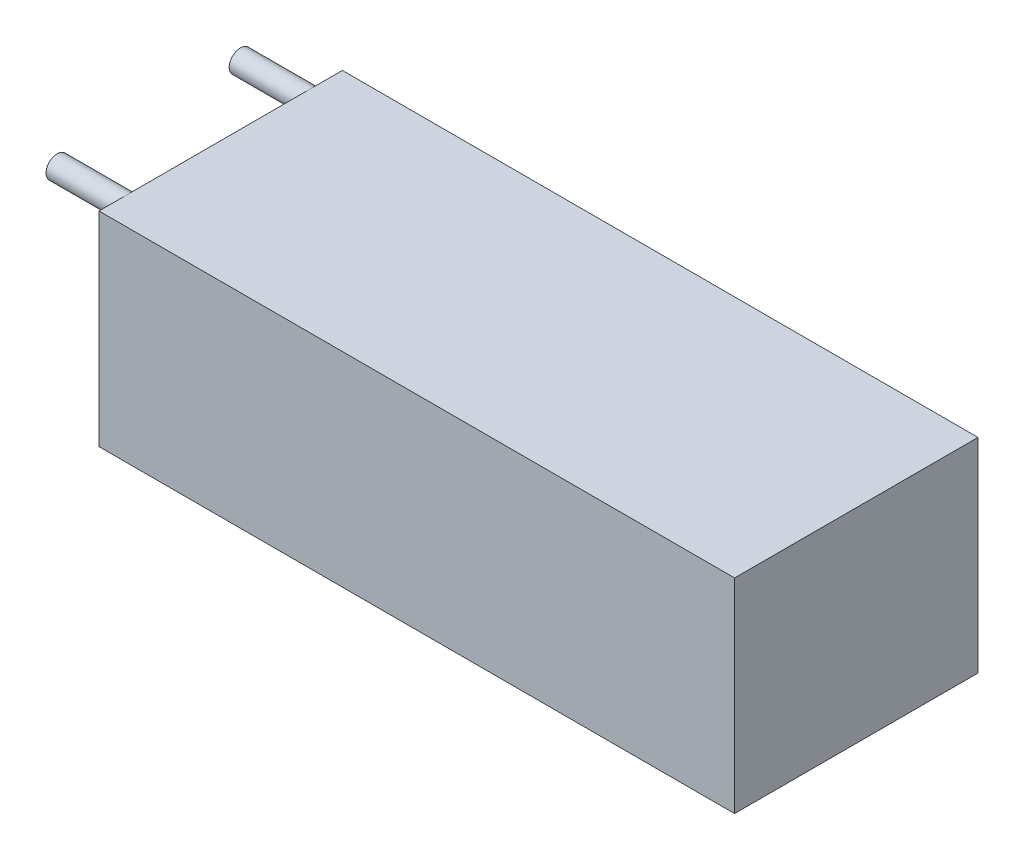
ISO-10303-21;
HEADER;
FILE_DESCRIPTION(('STEP AP214'),'2;1');
FILE_NAME('part.step','',(''),(''),'','','');
FILE_SCHEMA(('AUTOMOTIVE_DESIGN { 1 0 10303 214 1 1 1 1 }'));
ENDSEC;
DATA;
#1=APPLICATION_CONTEXT('core data for automotive mechanical design processes');
#2=APPLICATION_PROTOCOL_DEFINITION('international standard','automotive_design',2000,#1);
#3=PRODUCT_CONTEXT('',#1,'mechanical');
#4=PRODUCT('Part','Part','',(#3));
#5=PRODUCT_RELATED_PRODUCT_CATEGORY('part','',(#4));
#6=PRODUCT_DEFINITION_FORMATION('','',#4);
#7=PRODUCT_DEFINITION_CONTEXT('part definition',#1,'design');
#8=PRODUCT_DEFINITION('design','',#6,#7);
#9=PRODUCT_DEFINITION_SHAPE('','',#8);
#10=(LENGTH_UNIT() NAMED_UNIT(*) SI_UNIT(.MILLI.,.METRE.));
#11=(NAMED_UNIT(*) PLANE_ANGLE_UNIT() SI_UNIT($,.RADIAN.));
#12=(NAMED_UNIT(*) SI_UNIT($,.STERADIAN.) SOLID_ANGLE_UNIT());
#13=UNCERTAINTY_MEASURE_WITH_UNIT(LENGTH_MEASURE(1.E-05),#10,'distance_accuracy_value','');
#14=(GEOMETRIC_REPRESENTATION_CONTEXT(3) GLOBAL_UNCERTAINTY_ASSIGNED_CONTEXT((#13)) GLOBAL_UNIT_ASSIGNED_CONTEXT((#10,
#11,#12)) REPRESENTATION_CONTEXT('',''));
#15=CARTESIAN_POINT('',(0.,0.,0.));
#16=DIRECTION('',(0.,0.,1.));
#17=DIRECTION('',(1.,0.,0.));
#18=AXIS2_PLACEMENT_3D('',#15,#16,#17);
#19=CARTESIAN_POINT('',(0.,43.34,0.));
#20=DIRECTION('',(1.,0.,0.));
#21=DIRECTION('',(0.,0.,-1.));
#22=AXIS2_PLACEMENT_3D('',#19,#20,#21);
#23=PLANE('',#22);
#24=CARTESIAN_POINT('',(0.,40.9397624185994,-45.0375962735239));
#25=DIRECTION('',(-1.,0.,0.));
#26=DIRECTION('',(0.,0.,1.));
#27=AXIS2_PLACEMENT_3D('',#24,#25,#26);
#28=CIRCLE('',#27,2.37275363761213);
#29=CARTESIAN_POINT('',(0.,40.9397624185994,-42.6648426359118));
#30=VERTEX_POINT('',#29);
#31=EDGE_CURVE('E11',#30,#30,#28,.T.);
#32=ORIENTED_EDGE('',*,*,#31,.F.);
#33=EDGE_LOOP('',(#32));
#34=FACE_BOUND('',#33,.T.);
#35=CARTESIAN_POINT('',(0.,40.9397624185994,-6.11982388326591));
#36=DIRECTION('',(-1.,0.,0.));
#37=DIRECTION('',(0.,0.,1.));
#38=AXIS2_PLACEMENT_3D('',#35,#36,#37);
#39=CIRCLE('',#38,2.3619624985469);
#40=CARTESIAN_POINT('',(0.,40.9397624185994,-3.75786138471902));
#41=VERTEX_POINT('',#40);
#42=EDGE_CURVE('E53',#41,#41,#39,.T.);
#43=ORIENTED_EDGE('',*,*,#42,.F.);
#44=EDGE_LOOP('',(#43));
#45=FACE_BOUND('',#44,.T.);
#46=CARTESIAN_POINT('',(0.,1.97266458804956,-30.2488160437753));
#47=DIRECTION('',(-1.,0.,0.));
#48=DIRECTION('',(0.,0.,1.));
#49=AXIS2_PLACEMENT_3D('',#46,#47,#48);
#50=CIRCLE('',#49,1.08628014070586);
#51=CARTESIAN_POINT('',(0.,1.97266458804956,-29.1625359030694));
#52=VERTEX_POINT('',#51);
#53=EDGE_CURVE('E136',#52,#52,#50,.T.);
#54=ORIENTED_EDGE('',*,*,#53,.F.);
#55=EDGE_LOOP('',(#54));
#56=FACE_BOUND('',#55,.T.);
#57=CARTESIAN_POINT('',(0.,1.97266458804956,-27.2488160437753));
#58=DIRECTION('',(-1.,0.,0.));
#59=DIRECTION('',(0.,0.,1.));
#60=AXIS2_PLACEMENT_3D('',#57,#58,#59);
#61=CIRCLE('',#60,1.08628014070586);
#62=CARTESIAN_POINT('',(0.,1.97266458804956,-26.1625359030694));
#63=VERTEX_POINT('',#62);
#64=EDGE_CURVE('E133',#63,#63,#61,.T.);
#65=ORIENTED_EDGE('',*,*,#64,.F.);
#66=EDGE_LOOP('',(#65));
#67=FACE_BOUND('',#66,.T.);
#68=CARTESIAN_POINT('',(0.,1.97266458804956,-24.2488160437753));
#69=DIRECTION('',(-1.,0.,0.));
#70=DIRECTION('',(0.,0.,1.));
#71=AXIS2_PLACEMENT_3D('',#68,#69,#70);
#72=CIRCLE('',#71,1.08628014070586);
#73=CARTESIAN_POINT('',(0.,1.97266458804956,-23.1625359030694));
#74=VERTEX_POINT('',#73);
#75=EDGE_CURVE('E140',#74,#74,#72,.T.);
#76=ORIENTED_EDGE('',*,*,#75,.F.);
#77=EDGE_LOOP('',(#76));
#78=FACE_BOUND('',#77,.T.);
#79=CARTESIAN_POINT('',(0.,1.97266458804956,-21.2488160437753));
#80=DIRECTION('',(-1.,0.,0.));
#81=DIRECTION('',(0.,0.,1.));
#82=AXIS2_PLACEMENT_3D('',#79,#80,#81);
#83=CIRCLE('',#82,1.08628014070586);
#84=CARTESIAN_POINT('',(0.,1.97266458804956,-20.1625359030694));
#85=VERTEX_POINT('',#84);
#86=EDGE_CURVE('E157',#85,#85,#83,.T.);
#87=ORIENTED_EDGE('',*,*,#86,.F.);
#88=EDGE_LOOP('',(#87));
#89=FACE_BOUND('',#88,.T.);
#90=CARTESIAN_POINT('',(0.,1.97266458804956,-18.2488160437753));
#91=DIRECTION('',(-1.,0.,0.));
#92=DIRECTION('',(0.,0.,1.));
#93=AXIS2_PLACEMENT_3D('',#90,#91,#92);
#94=CIRCLE('',#93,1.08628014070586);
#95=CARTESIAN_POINT('',(0.,1.97266458804956,-17.1625359030694));
#96=VERTEX_POINT('',#95);
#97=EDGE_CURVE('E129',#96,#96,#94,.T.);
#98=ORIENTED_EDGE('',*,*,#97,.F.);
#99=EDGE_LOOP('',(#98));
#100=FACE_BOUND('',#99,.T.);
#101=CARTESIAN_POINT('',(0.,1.97266458804956,-33.2488160437753));
#102=DIRECTION('',(-1.,0.,0.));
#103=DIRECTION('',(0.,0.,1.));
#104=AXIS2_PLACEMENT_3D('',#101,#102,#103);
#105=CIRCLE('',#104,1.08628014070586);
#106=CARTESIAN_POINT('',(0.,1.97266458804956,-32.1625359030694));
#107=VERTEX_POINT('',#106);
#108=EDGE_CURVE('E128',#107,#107,#105,.T.);
#109=ORIENTED_EDGE('',*,*,#108,.F.);
#110=EDGE_LOOP('',(#109));
#111=FACE_BOUND('',#110,.T.);
#112=DIRECTION('',(0.,0.,1.));
#113=VECTOR('',#112,1.);
#114=CARTESIAN_POINT('',(0.,0.,0.));
#115=LINE('',#114,#113);
#116=CARTESIAN_POINT('',(0.,0.,-51.7));
#117=VERTEX_POINT('',#116);
#118=CARTESIAN_POINT('',(0.,0.,0.));
#119=VERTEX_POINT('',#118);
#120=EDGE_CURVE('E115',#117,#119,#115,.T.);
#121=ORIENTED_EDGE('',*,*,#120,.T.);
#122=DIRECTION('',(0.,-1.,0.));
#123=VECTOR('',#122,1.);
#124=CARTESIAN_POINT('',(0.,43.34,0.));
#125=LINE('',#124,#123);
#126=CARTESIAN_POINT('',(0.,43.34,0.));
#127=VERTEX_POINT('',#126);
#128=EDGE_CURVE('E48',#127,#119,#125,.T.);
#129=ORIENTED_EDGE('',*,*,#128,.F.);
#130=DIRECTION('',(0.,0.,1.));
#131=VECTOR('',#130,1.);
#132=CARTESIAN_POINT('',(0.,43.34,0.));
#133=LINE('',#132,#131);
#134=CARTESIAN_POINT('',(0.,43.34,-51.7));
#135=VERTEX_POINT('',#134);
#136=EDGE_CURVE('E98',#135,#127,#133,.T.);
#137=ORIENTED_EDGE('',*,*,#136,.F.);
#138=DIRECTION('',(0.,-1.,0.));
#139=VECTOR('',#138,1.);
#140=CARTESIAN_POINT('',(0.,43.34,-51.7));
#141=LINE('',#140,#139);
#142=EDGE_CURVE('E106',#135,#117,#141,.T.);
#143=ORIENTED_EDGE('',*,*,#142,.T.);
#144=EDGE_LOOP('',(#121,#129,#137,#143));
#145=FACE_BOUND('',#144,.T.);
#146=ADVANCED_FACE('F44',(#34,#45,#56,#67,#78,#89,#100,#111,#145),#23,.F.);
#147=CARTESIAN_POINT('',(0.,43.34,0.));
#148=DIRECTION('',(0.,0.,-1.));
#149=DIRECTION('',(-1.,0.,0.));
#150=AXIS2_PLACEMENT_3D('',#147,#148,#149);
#151=PLANE('',#150);
#152=DIRECTION('',(1.,0.,0.));
#153=VECTOR('',#152,1.);
#154=CARTESIAN_POINT('',(0.,0.,0.));
#155=LINE('',#154,#153);
#156=CARTESIAN_POINT('',(135.,0.,0.));
#157=VERTEX_POINT('',#156);
#158=EDGE_CURVE('E101',#119,#157,#155,.T.);
#159=ORIENTED_EDGE('',*,*,#158,.T.);
#160=DIRECTION('',(0.,-1.,0.));
#161=VECTOR('',#160,1.);
#162=CARTESIAN_POINT('',(135.,43.34,0.));
#163=LINE('',#162,#161);
#164=CARTESIAN_POINT('',(135.,43.34,0.));
#165=VERTEX_POINT('',#164);
#166=EDGE_CURVE('E105',#165,#157,#163,.T.);
#167=ORIENTED_EDGE('',*,*,#166,.F.);
#168=DIRECTION('',(1.,0.,0.));
#169=VECTOR('',#168,1.);
#170=CARTESIAN_POINT('',(0.,43.34,0.));
#171=LINE('',#170,#169);
#172=EDGE_CURVE('E92',#127,#165,#171,.T.);
#173=ORIENTED_EDGE('',*,*,#172,.F.);
#174=ORIENTED_EDGE('',*,*,#128,.T.);
#175=EDGE_LOOP('',(#159,#167,#173,#174));
#176=FACE_BOUND('',#175,.T.);
#177=ADVANCED_FACE('F104',(#176),#151,.F.);
#178=CARTESIAN_POINT('',(135.,43.34,0.));
#179=DIRECTION('',(-1.,0.,0.));
#180=DIRECTION('',(0.,0.,1.));
#181=AXIS2_PLACEMENT_3D('',#178,#179,#180);
#182=PLANE('',#181);
#183=DIRECTION('',(0.,0.,-1.));
#184=VECTOR('',#183,1.);
#185=CARTESIAN_POINT('',(135.,0.,0.));
#186=LINE('',#185,#184);
#187=CARTESIAN_POINT('',(135.,0.,-51.7));
#188=VERTEX_POINT('',#187);
#189=EDGE_CURVE('E79',#157,#188,#186,.T.);
#190=ORIENTED_EDGE('',*,*,#189,.T.);
#191=DIRECTION('',(0.,-1.,0.));
#192=VECTOR('',#191,1.);
#193=CARTESIAN_POINT('',(135.,43.34,-51.7));
#194=LINE('',#193,#192);
#195=CARTESIAN_POINT('',(135.,43.34,-51.7));
#196=VERTEX_POINT('',#195);
#197=EDGE_CURVE('E103',#196,#188,#194,.T.);
#198=ORIENTED_EDGE('',*,*,#197,.F.);
#199=DIRECTION('',(0.,0.,-1.));
#200=VECTOR('',#199,1.);
#201=CARTESIAN_POINT('',(135.,43.34,0.));
#202=LINE('',#201,#200);
#203=EDGE_CURVE('E100',#165,#196,#202,.T.);
#204=ORIENTED_EDGE('',*,*,#203,.F.);
#205=ORIENTED_EDGE('',*,*,#166,.T.);
#206=EDGE_LOOP('',(#190,#198,#204,#205));
#207=FACE_BOUND('',#206,.T.);
#208=ADVANCED_FACE('F108',(#207),#182,.F.);
#209=CARTESIAN_POINT('',(0.,43.34,-51.7));
#210=DIRECTION('',(0.,0.,1.));
#211=DIRECTION('',(1.,0.,0.));
#212=AXIS2_PLACEMENT_3D('',#209,#210,#211);
#213=PLANE('',#212);
#214=DIRECTION('',(-1.,0.,0.));
#215=VECTOR('',#214,1.);
#216=CARTESIAN_POINT('',(0.,0.,-51.7));
#217=LINE('',#216,#215);
#218=EDGE_CURVE('E86',#188,#117,#217,.T.);
#219=ORIENTED_EDGE('',*,*,#218,.T.);
#220=ORIENTED_EDGE('',*,*,#142,.F.);
#221=DIRECTION('',(-1.,0.,0.));
#222=VECTOR('',#221,1.);
#223=CARTESIAN_POINT('',(0.,43.34,-51.7));
#224=LINE('',#223,#222);
#225=EDGE_CURVE('E61',#196,#135,#224,.T.);
#226=ORIENTED_EDGE('',*,*,#225,.F.);
#227=ORIENTED_EDGE('',*,*,#197,.T.);
#228=EDGE_LOOP('',(#219,#220,#226,#227));
#229=FACE_BOUND('',#228,.T.);
#230=ADVANCED_FACE('F119',(#229),#213,.F.);
#231=CARTESIAN_POINT('',(0.,43.34,0.));
#232=DIRECTION('',(0.,-1.,0.));
#233=DIRECTION('',(0.,0.,-1.));
#234=AXIS2_PLACEMENT_3D('',#231,#232,#233);
#235=PLANE('',#234);
#236=ORIENTED_EDGE('',*,*,#136,.T.);
#237=ORIENTED_EDGE('',*,*,#172,.T.);
#238=ORIENTED_EDGE('',*,*,#203,.T.);
#239=ORIENTED_EDGE('',*,*,#225,.T.);
#240=EDGE_LOOP('',(#236,#237,#238,#239));
#241=FACE_BOUND('',#240,.T.);
#242=ADVANCED_FACE('F94',(#241),#235,.F.);
#243=CARTESIAN_POINT('',(0.,0.,0.));
#244=DIRECTION('',(0.,-1.,0.));
#245=DIRECTION('',(0.,0.,-1.));
#246=AXIS2_PLACEMENT_3D('',#243,#244,#245);
#247=PLANE('',#246);
#248=ORIENTED_EDGE('',*,*,#120,.F.);
#249=ORIENTED_EDGE('',*,*,#218,.F.);
#250=ORIENTED_EDGE('',*,*,#189,.F.);
#251=ORIENTED_EDGE('',*,*,#158,.F.);
#252=EDGE_LOOP('',(#248,#249,#250,#251));
#253=FACE_BOUND('',#252,.T.);
#254=ADVANCED_FACE('F121',(#253),#247,.T.);
#255=CARTESIAN_POINT('',(-15.,1.97266458804956,-33.2488160437753));
#256=DIRECTION('',(1.,0.,0.));
#257=DIRECTION('',(0.,0.,-1.));
#258=AXIS2_PLACEMENT_3D('',#255,#256,#257);
#259=CYLINDRICAL_SURFACE('',#258,1.08628014070586);
#260=CARTESIAN_POINT('',(-15.,1.97266458804956,-33.2488160437753));
#261=DIRECTION('',(-1.,0.,0.));
#262=DIRECTION('',(0.,0.,1.));
#263=AXIS2_PLACEMENT_3D('',#260,#261,#262);
#264=CIRCLE('',#263,1.08628014070586);
#265=CARTESIAN_POINT('',(-15.,1.97266458804956,-32.1625359030694));
#266=VERTEX_POINT('',#265);
#267=EDGE_CURVE('E113',#266,#266,#264,.T.);
#268=ORIENTED_EDGE('',*,*,#267,.F.);
#269=EDGE_LOOP('',(#268));
#270=FACE_BOUND('',#269,.T.);
#271=ORIENTED_EDGE('',*,*,#108,.T.);
#272=EDGE_LOOP('',(#271));
#273=FACE_BOUND('',#272,.T.);
#274=ADVANCED_FACE('F187',(#270,#273),#259,.T.);
#275=CARTESIAN_POINT('',(-15.,1.97266458804956,-33.2488160437753));
#276=DIRECTION('',(-1.,0.,0.));
#277=DIRECTION('',(0.,0.,1.));
#278=AXIS2_PLACEMENT_3D('',#275,#276,#277);
#279=PLANE('',#278);
#280=ORIENTED_EDGE('',*,*,#267,.T.);
#281=EDGE_LOOP('',(#280));
#282=FACE_BOUND('',#281,.T.);
#283=ADVANCED_FACE('F189',(#282),#279,.T.);
#284=CARTESIAN_POINT('',(-15.,1.97266458804956,-18.2488160437753));
#285=DIRECTION('',(1.,0.,0.));
#286=DIRECTION('',(0.,0.,-1.));
#287=AXIS2_PLACEMENT_3D('',#284,#285,#286);
#288=CYLINDRICAL_SURFACE('',#287,1.08628014070586);
#289=CARTESIAN_POINT('',(-15.,1.97266458804956,-18.2488160437753));
#290=DIRECTION('',(-1.,0.,0.));
#291=DIRECTION('',(0.,0.,1.));
#292=AXIS2_PLACEMENT_3D('',#289,#290,#291);
#293=CIRCLE('',#292,1.08628014070586);
#294=CARTESIAN_POINT('',(-15.,1.97266458804956,-17.1625359030694));
#295=VERTEX_POINT('',#294);
#296=EDGE_CURVE('E160',#295,#295,#293,.T.);
#297=ORIENTED_EDGE('',*,*,#296,.F.);
#298=EDGE_LOOP('',(#297));
#299=FACE_BOUND('',#298,.T.);
#300=ORIENTED_EDGE('',*,*,#97,.T.);
#301=EDGE_LOOP('',(#300));
#302=FACE_BOUND('',#301,.T.);
#303=ADVANCED_FACE('F196',(#299,#302),#288,.T.);
#304=CARTESIAN_POINT('',(-15.,1.97266458804956,-18.2488160437753));
#305=DIRECTION('',(-1.,0.,0.));
#306=DIRECTION('',(0.,0.,1.));
#307=AXIS2_PLACEMENT_3D('',#304,#305,#306);
#308=PLANE('',#307);
#309=ORIENTED_EDGE('',*,*,#296,.T.);
#310=EDGE_LOOP('',(#309));
#311=FACE_BOUND('',#310,.T.);
#312=ADVANCED_FACE('F244',(#311),#308,.T.);
#313=CARTESIAN_POINT('',(-15.,1.97266458804956,-21.2488160437753));
#314=DIRECTION('',(1.,0.,0.));
#315=DIRECTION('',(0.,0.,-1.));
#316=AXIS2_PLACEMENT_3D('',#313,#314,#315);
#317=CYLINDRICAL_SURFACE('',#316,1.08628014070586);
#318=CARTESIAN_POINT('',(-15.,1.97266458804956,-21.2488160437753));
#319=DIRECTION('',(-1.,0.,0.));
#320=DIRECTION('',(0.,0.,1.));
#321=AXIS2_PLACEMENT_3D('',#318,#319,#320);
#322=CIRCLE('',#321,1.08628014070586);
#323=CARTESIAN_POINT('',(-15.,1.97266458804956,-20.1625359030694));
#324=VERTEX_POINT('',#323);
#325=EDGE_CURVE('E158',#324,#324,#322,.T.);
#326=ORIENTED_EDGE('',*,*,#325,.F.);
#327=EDGE_LOOP('',(#326));
#328=FACE_BOUND('',#327,.T.);
#329=ORIENTED_EDGE('',*,*,#86,.T.);
#330=EDGE_LOOP('',(#329));
#331=FACE_BOUND('',#330,.T.);
#332=ADVANCED_FACE('F252',(#328,#331),#317,.T.);
#333=CARTESIAN_POINT('',(-15.,1.97266458804956,-21.2488160437753));
#334=DIRECTION('',(-1.,0.,0.));
#335=DIRECTION('',(0.,0.,1.));
#336=AXIS2_PLACEMENT_3D('',#333,#334,#335);
#337=PLANE('',#336);
#338=ORIENTED_EDGE('',*,*,#325,.T.);
#339=EDGE_LOOP('',(#338));
#340=FACE_BOUND('',#339,.T.);
#341=ADVANCED_FACE('F172',(#340),#337,.T.);
#342=CARTESIAN_POINT('',(-15.,1.97266458804956,-24.2488160437753));
#343=DIRECTION('',(1.,0.,0.));
#344=DIRECTION('',(0.,0.,-1.));
#345=AXIS2_PLACEMENT_3D('',#342,#343,#344);
#346=CYLINDRICAL_SURFACE('',#345,1.08628014070586);
#347=CARTESIAN_POINT('',(-15.,1.97266458804956,-24.2488160437753));
#348=DIRECTION('',(-1.,0.,0.));
#349=DIRECTION('',(0.,0.,1.));
#350=AXIS2_PLACEMENT_3D('',#347,#348,#349);
#351=CIRCLE('',#350,1.08628014070586);
#352=CARTESIAN_POINT('',(-15.,1.97266458804956,-23.1625359030694));
#353=VERTEX_POINT('',#352);
#354=EDGE_CURVE('E145',#353,#353,#351,.T.);
#355=ORIENTED_EDGE('',*,*,#354,.F.);
#356=EDGE_LOOP('',(#355));
#357=FACE_BOUND('',#356,.T.);
#358=ORIENTED_EDGE('',*,*,#75,.T.);
#359=EDGE_LOOP('',(#358));
#360=FACE_BOUND('',#359,.T.);
#361=ADVANCED_FACE('F175',(#357,#360),#346,.T.);
#362=CARTESIAN_POINT('',(-15.,1.97266458804956,-24.2488160437753));
#363=DIRECTION('',(-1.,0.,0.));
#364=DIRECTION('',(0.,0.,1.));
#365=AXIS2_PLACEMENT_3D('',#362,#363,#364);
#366=PLANE('',#365);
#367=ORIENTED_EDGE('',*,*,#354,.T.);
#368=EDGE_LOOP('',(#367));
#369=FACE_BOUND('',#368,.T.);
#370=ADVANCED_FACE('F169',(#369),#366,.T.);
#371=CARTESIAN_POINT('',(-15.,1.97266458804956,-27.2488160437753));
#372=DIRECTION('',(1.,0.,0.));
#373=DIRECTION('',(0.,0.,-1.));
#374=AXIS2_PLACEMENT_3D('',#371,#372,#373);
#375=CYLINDRICAL_SURFACE('',#374,1.08628014070586);
#376=CARTESIAN_POINT('',(-15.,1.97266458804956,-27.2488160437753));
#377=DIRECTION('',(-1.,0.,0.));
#378=DIRECTION('',(0.,0.,1.));
#379=AXIS2_PLACEMENT_3D('',#376,#377,#378);
#380=CIRCLE('',#379,1.08628014070586);
#381=CARTESIAN_POINT('',(-15.,1.97266458804956,-26.1625359030694));
#382=VERTEX_POINT('',#381);
#383=EDGE_CURVE('E138',#382,#382,#380,.T.);
#384=ORIENTED_EDGE('',*,*,#383,.F.);
#385=EDGE_LOOP('',(#384));
#386=FACE_BOUND('',#385,.T.);
#387=ORIENTED_EDGE('',*,*,#64,.T.);
#388=EDGE_LOOP('',(#387));
#389=FACE_BOUND('',#388,.T.);
#390=ADVANCED_FACE('F269',(#386,#389),#375,.T.);
#391=CARTESIAN_POINT('',(-15.,1.97266458804956,-27.2488160437753));
#392=DIRECTION('',(-1.,0.,0.));
#393=DIRECTION('',(0.,0.,1.));
#394=AXIS2_PLACEMENT_3D('',#391,#392,#393);
#395=PLANE('',#394);
#396=ORIENTED_EDGE('',*,*,#383,.T.);
#397=EDGE_LOOP('',(#396));
#398=FACE_BOUND('',#397,.T.);
#399=ADVANCED_FACE('F273',(#398),#395,.T.);
#400=CARTESIAN_POINT('',(-15.,1.97266458804956,-30.2488160437753));
#401=DIRECTION('',(1.,0.,0.));
#402=DIRECTION('',(0.,0.,-1.));
#403=AXIS2_PLACEMENT_3D('',#400,#401,#402);
#404=CYLINDRICAL_SURFACE('',#403,1.08628014070586);
#405=CARTESIAN_POINT('',(-15.,1.97266458804956,-30.2488160437753));
#406=DIRECTION('',(-1.,0.,0.));
#407=DIRECTION('',(0.,0.,1.));
#408=AXIS2_PLACEMENT_3D('',#405,#406,#407);
#409=CIRCLE('',#408,1.08628014070586);
#410=CARTESIAN_POINT('',(-15.,1.97266458804956,-29.1625359030694));
#411=VERTEX_POINT('',#410);
#412=EDGE_CURVE('E141',#411,#411,#409,.T.);
#413=ORIENTED_EDGE('',*,*,#412,.F.);
#414=EDGE_LOOP('',(#413));
#415=FACE_BOUND('',#414,.T.);
#416=ORIENTED_EDGE('',*,*,#53,.T.);
#417=EDGE_LOOP('',(#416));
#418=FACE_BOUND('',#417,.T.);
#419=ADVANCED_FACE('F278',(#415,#418),#404,.T.);
#420=CARTESIAN_POINT('',(-15.,1.97266458804956,-30.2488160437753));
#421=DIRECTION('',(-1.,0.,0.));
#422=DIRECTION('',(0.,0.,1.));
#423=AXIS2_PLACEMENT_3D('',#420,#421,#422);
#424=PLANE('',#423);
#425=ORIENTED_EDGE('',*,*,#412,.T.);
#426=EDGE_LOOP('',(#425));
#427=FACE_BOUND('',#426,.T.);
#428=ADVANCED_FACE('F285',(#427),#424,.T.);
#429=CARTESIAN_POINT('',(-15.,40.9397624185994,-6.11982388326591));
#430=DIRECTION('',(1.,0.,0.));
#431=DIRECTION('',(0.,0.,-1.));
#432=AXIS2_PLACEMENT_3D('',#429,#430,#431);
#433=CYLINDRICAL_SURFACE('',#432,2.3619624985469);
#434=CARTESIAN_POINT('',(-15.,40.9397624185994,-6.11982388326591));
#435=DIRECTION('',(-1.,0.,0.));
#436=DIRECTION('',(0.,0.,1.));
#437=AXIS2_PLACEMENT_3D('',#434,#435,#436);
#438=CIRCLE('',#437,2.3619624985469);
#439=CARTESIAN_POINT('',(-15.,40.9397624185994,-3.75786138471902));
#440=VERTEX_POINT('',#439);
#441=EDGE_CURVE('E150',#440,#440,#438,.T.);
#442=ORIENTED_EDGE('',*,*,#441,.F.);
#443=EDGE_LOOP('',(#442));
#444=FACE_BOUND('',#443,.T.);
#445=ORIENTED_EDGE('',*,*,#42,.T.);
#446=EDGE_LOOP('',(#445));
#447=FACE_BOUND('',#446,.T.);
#448=ADVANCED_FACE('F287',(#444,#447),#433,.T.);
#449=CARTESIAN_POINT('',(-15.,40.9397624185994,-6.11982388326591));
#450=DIRECTION('',(-1.,0.,0.));
#451=DIRECTION('',(0.,0.,1.));
#452=AXIS2_PLACEMENT_3D('',#449,#450,#451);
#453=PLANE('',#452);
#454=ORIENTED_EDGE('',*,*,#441,.T.);
#455=EDGE_LOOP('',(#454));
#456=FACE_BOUND('',#455,.T.);
#457=ADVANCED_FACE('F291',(#456),#453,.T.);
#458=CARTESIAN_POINT('',(-15.,40.9397624185994,-45.0375962735239));
#459=DIRECTION('',(1.,0.,0.));
#460=DIRECTION('',(0.,0.,-1.));
#461=AXIS2_PLACEMENT_3D('',#458,#459,#460);
#462=CYLINDRICAL_SURFACE('',#461,2.37275363761213);
#463=CARTESIAN_POINT('',(-15.,40.9397624185994,-45.0375962735239));
#464=DIRECTION('',(-1.,0.,0.));
#465=DIRECTION('',(0.,0.,1.));
#466=AXIS2_PLACEMENT_3D('',#463,#464,#465);
#467=CIRCLE('',#466,2.37275363761213);
#468=CARTESIAN_POINT('',(-15.,40.9397624185994,-42.6648426359118));
#469=VERTEX_POINT('',#468);
#470=EDGE_CURVE('E135',#469,#469,#467,.T.);
#471=ORIENTED_EDGE('',*,*,#470,.F.);
#472=EDGE_LOOP('',(#471));
#473=FACE_BOUND('',#472,.T.);
#474=ORIENTED_EDGE('',*,*,#31,.T.);
#475=EDGE_LOOP('',(#474));
#476=FACE_BOUND('',#475,.T.);
#477=ADVANCED_FACE('F299',(#473,#476),#462,.T.);
#478=CARTESIAN_POINT('',(-15.,40.9397624185994,-45.0375962735239));
#479=DIRECTION('',(-1.,0.,0.));
#480=DIRECTION('',(0.,0.,1.));
#481=AXIS2_PLACEMENT_3D('',#478,#479,#480);
#482=PLANE('',#481);
#483=ORIENTED_EDGE('',*,*,#470,.T.);
#484=EDGE_LOOP('',(#483));
#485=FACE_BOUND('',#484,.T.);
#486=ADVANCED_FACE('F302',(#485),#482,.T.);
#487=CLOSED_SHELL('',(#146,#177,#208,#230,#242,#254,#274,#283,#303,#312,#332,#341,#361,#370,
#390,#399,#419,#428,#448,#457,#477,#486));
#488=MANIFOLD_SOLID_BREP('B2',#487);
#489=ADVANCED_BREP_SHAPE_REPRESENTATION('',(#18,#488),#14);
#490=SHAPE_DEFINITION_REPRESENTATION(#9,#489);
ENDSEC;
END-ISO-10303-21;
